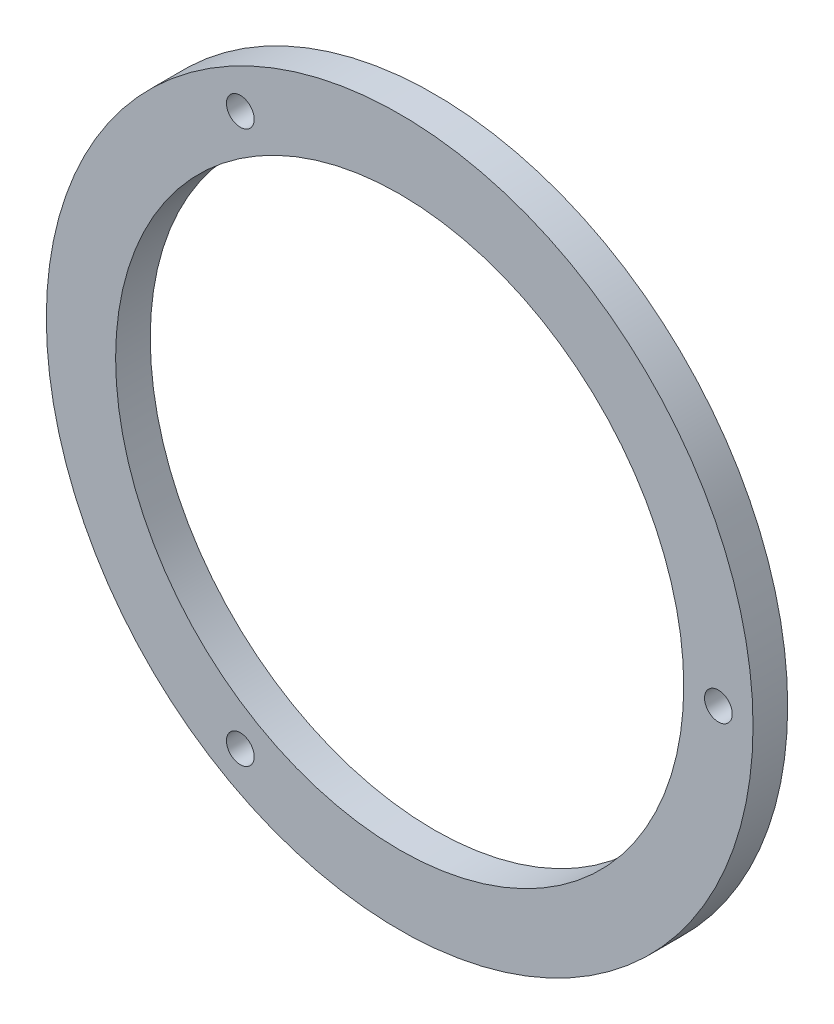
ISO-10303-21;
HEADER;
FILE_DESCRIPTION(('STEP AP214'),'2;1');
FILE_NAME('part.step','',(''),(''),'','','');
FILE_SCHEMA(('AUTOMOTIVE_DESIGN { 1 0 10303 214 1 1 1 1 }'));
ENDSEC;
DATA;
#1=APPLICATION_CONTEXT('core data for automotive mechanical design processes');
#2=APPLICATION_PROTOCOL_DEFINITION('international standard','automotive_design',2000,#1);
#3=PRODUCT_CONTEXT('',#1,'mechanical');
#4=PRODUCT('Part','Part','',(#3));
#5=PRODUCT_RELATED_PRODUCT_CATEGORY('part','',(#4));
#6=PRODUCT_DEFINITION_FORMATION('','',#4);
#7=PRODUCT_DEFINITION_CONTEXT('part definition',#1,'design');
#8=PRODUCT_DEFINITION('design','',#6,#7);
#9=PRODUCT_DEFINITION_SHAPE('','',#8);
#10=(LENGTH_UNIT() NAMED_UNIT(*) SI_UNIT(.MILLI.,.METRE.));
#11=(NAMED_UNIT(*) PLANE_ANGLE_UNIT() SI_UNIT($,.RADIAN.));
#12=(NAMED_UNIT(*) SI_UNIT($,.STERADIAN.) SOLID_ANGLE_UNIT());
#13=UNCERTAINTY_MEASURE_WITH_UNIT(LENGTH_MEASURE(1.E-05),#10,'distance_accuracy_value','');
#14=(GEOMETRIC_REPRESENTATION_CONTEXT(3) GLOBAL_UNCERTAINTY_ASSIGNED_CONTEXT((#13)) GLOBAL_UNIT_ASSIGNED_CONTEXT((#10,
#11,#12)) REPRESENTATION_CONTEXT('',''));
#15=CARTESIAN_POINT('',(0.,0.,0.));
#16=DIRECTION('',(0.,0.,1.));
#17=DIRECTION('',(1.,0.,0.));
#18=AXIS2_PLACEMENT_3D('',#15,#16,#17);
#19=CARTESIAN_POINT('',(0.,0.,5.));
#20=DIRECTION('',(0.,0.,1.));
#21=DIRECTION('',(1.,0.,0.));
#22=AXIS2_PLACEMENT_3D('',#19,#20,#21);
#23=PLANE('',#22);
#24=CARTESIAN_POINT('',(-23.,39.8371685740842,5.));
#25=DIRECTION('',(0.,0.,1.));
#26=DIRECTION('',(1.,0.,0.));
#27=AXIS2_PLACEMENT_3D('',#24,#25,#26);
#28=CIRCLE('',#27,2.);
#29=CARTESIAN_POINT('',(-21.,39.8371685740842,5.));
#30=VERTEX_POINT('',#29);
#31=EDGE_CURVE('E52',#30,#30,#28,.T.);
#32=ORIENTED_EDGE('',*,*,#31,.F.);
#33=EDGE_LOOP('',(#32));
#34=FACE_BOUND('',#33,.T.);
#35=CARTESIAN_POINT('',(46.,0.,5.));
#36=DIRECTION('',(0.,0.,1.));
#37=DIRECTION('',(1.,0.,0.));
#38=AXIS2_PLACEMENT_3D('',#35,#36,#37);
#39=CIRCLE('',#38,2.);
#40=CARTESIAN_POINT('',(48.,0.,5.));
#41=VERTEX_POINT('',#40);
#42=EDGE_CURVE('E41',#41,#41,#39,.T.);
#43=ORIENTED_EDGE('',*,*,#42,.F.);
#44=EDGE_LOOP('',(#43));
#45=FACE_BOUND('',#44,.T.);
#46=CARTESIAN_POINT('',(0.,0.,5.));
#47=DIRECTION('',(0.,0.,1.));
#48=DIRECTION('',(1.,0.,0.));
#49=AXIS2_PLACEMENT_3D('',#46,#47,#48);
#50=CIRCLE('',#49,51.);
#51=CARTESIAN_POINT('',(51.,0.,5.));
#52=VERTEX_POINT('',#51);
#53=EDGE_CURVE('E10',#52,#52,#50,.T.);
#54=ORIENTED_EDGE('',*,*,#53,.T.);
#55=EDGE_LOOP('',(#54));
#56=FACE_BOUND('',#55,.T.);
#57=CARTESIAN_POINT('',(-23.,-39.8371685740842,5.));
#58=DIRECTION('',(0.,0.,1.));
#59=DIRECTION('',(1.,0.,0.));
#60=AXIS2_PLACEMENT_3D('',#57,#58,#59);
#61=CIRCLE('',#60,2.);
#62=CARTESIAN_POINT('',(-21.,-39.8371685740842,5.));
#63=VERTEX_POINT('',#62);
#64=EDGE_CURVE('E46',#63,#63,#61,.T.);
#65=ORIENTED_EDGE('',*,*,#64,.F.);
#66=EDGE_LOOP('',(#65));
#67=FACE_BOUND('',#66,.T.);
#68=CARTESIAN_POINT('',(0.,0.,5.));
#69=DIRECTION('',(0.,0.,1.));
#70=DIRECTION('',(1.,0.,0.));
#71=AXIS2_PLACEMENT_3D('',#68,#69,#70);
#72=CIRCLE('',#71,41.);
#73=CARTESIAN_POINT('',(41.,0.,5.));
#74=VERTEX_POINT('',#73);
#75=EDGE_CURVE('E58',#74,#74,#72,.T.);
#76=ORIENTED_EDGE('',*,*,#75,.F.);
#77=EDGE_LOOP('',(#76));
#78=FACE_BOUND('',#77,.T.);
#79=ADVANCED_FACE('F30',(#34,#45,#56,#67,#78),#23,.T.);
#80=CARTESIAN_POINT('',(0.,0.,0.));
#81=DIRECTION('',(0.,0.,1.));
#82=DIRECTION('',(1.,0.,0.));
#83=AXIS2_PLACEMENT_3D('',#80,#81,#82);
#84=PLANE('',#83);
#85=CARTESIAN_POINT('',(0.,0.,0.));
#86=DIRECTION('',(0.,0.,1.));
#87=DIRECTION('',(1.,0.,0.));
#88=AXIS2_PLACEMENT_3D('',#85,#86,#87);
#89=CIRCLE('',#88,51.);
#90=CARTESIAN_POINT('',(51.,0.,0.));
#91=VERTEX_POINT('',#90);
#92=EDGE_CURVE('E34',#91,#91,#89,.T.);
#93=ORIENTED_EDGE('',*,*,#92,.F.);
#94=EDGE_LOOP('',(#93));
#95=FACE_BOUND('',#94,.T.);
#96=CARTESIAN_POINT('',(46.,0.,0.));
#97=DIRECTION('',(0.,0.,1.));
#98=DIRECTION('',(1.,0.,0.));
#99=AXIS2_PLACEMENT_3D('',#96,#97,#98);
#100=CIRCLE('',#99,2.);
#101=CARTESIAN_POINT('',(48.,0.,0.));
#102=VERTEX_POINT('',#101);
#103=EDGE_CURVE('E43',#102,#102,#100,.T.);
#104=ORIENTED_EDGE('',*,*,#103,.T.);
#105=EDGE_LOOP('',(#104));
#106=FACE_BOUND('',#105,.T.);
#107=CARTESIAN_POINT('',(-23.,-39.8371685740842,0.));
#108=DIRECTION('',(0.,0.,1.));
#109=DIRECTION('',(1.,0.,0.));
#110=AXIS2_PLACEMENT_3D('',#107,#108,#109);
#111=CIRCLE('',#110,2.);
#112=CARTESIAN_POINT('',(-21.,-39.8371685740842,0.));
#113=VERTEX_POINT('',#112);
#114=EDGE_CURVE('E49',#113,#113,#111,.T.);
#115=ORIENTED_EDGE('',*,*,#114,.T.);
#116=EDGE_LOOP('',(#115));
#117=FACE_BOUND('',#116,.T.);
#118=CARTESIAN_POINT('',(-23.,39.8371685740842,0.));
#119=DIRECTION('',(0.,0.,1.));
#120=DIRECTION('',(1.,0.,0.));
#121=AXIS2_PLACEMENT_3D('',#118,#119,#120);
#122=CIRCLE('',#121,2.);
#123=CARTESIAN_POINT('',(-21.,39.8371685740842,0.));
#124=VERTEX_POINT('',#123);
#125=EDGE_CURVE('E55',#124,#124,#122,.T.);
#126=ORIENTED_EDGE('',*,*,#125,.T.);
#127=EDGE_LOOP('',(#126));
#128=FACE_BOUND('',#127,.T.);
#129=CARTESIAN_POINT('',(0.,0.,0.));
#130=DIRECTION('',(0.,0.,1.));
#131=DIRECTION('',(1.,0.,0.));
#132=AXIS2_PLACEMENT_3D('',#129,#130,#131);
#133=CIRCLE('',#132,41.);
#134=CARTESIAN_POINT('',(41.,0.,0.));
#135=VERTEX_POINT('',#134);
#136=EDGE_CURVE('E61',#135,#135,#133,.T.);
#137=ORIENTED_EDGE('',*,*,#136,.T.);
#138=EDGE_LOOP('',(#137));
#139=FACE_BOUND('',#138,.T.);
#140=ADVANCED_FACE('F71',(#95,#106,#117,#128,#139),#84,.F.);
#141=CARTESIAN_POINT('',(0.,0.,5.));
#142=DIRECTION('',(0.,0.,-1.));
#143=DIRECTION('',(-1.,0.,0.));
#144=AXIS2_PLACEMENT_3D('',#141,#142,#143);
#145=CYLINDRICAL_SURFACE('',#144,51.);
#146=ORIENTED_EDGE('',*,*,#53,.F.);
#147=EDGE_LOOP('',(#146));
#148=FACE_BOUND('',#147,.T.);
#149=ORIENTED_EDGE('',*,*,#92,.T.);
#150=EDGE_LOOP('',(#149));
#151=FACE_BOUND('',#150,.T.);
#152=ADVANCED_FACE('F32',(#148,#151),#145,.T.);
#153=CARTESIAN_POINT('',(46.,0.,5.));
#154=DIRECTION('',(0.,0.,-1.));
#155=DIRECTION('',(-1.,0.,0.));
#156=AXIS2_PLACEMENT_3D('',#153,#154,#155);
#157=CYLINDRICAL_SURFACE('',#156,2.);
#158=ORIENTED_EDGE('',*,*,#42,.T.);
#159=EDGE_LOOP('',(#158));
#160=FACE_BOUND('',#159,.T.);
#161=ORIENTED_EDGE('',*,*,#103,.F.);
#162=EDGE_LOOP('',(#161));
#163=FACE_BOUND('',#162,.T.);
#164=ADVANCED_FACE('F81',(#160,#163),#157,.F.);
#165=CARTESIAN_POINT('',(-23.,-39.8371685740842,5.));
#166=DIRECTION('',(0.,0.,-1.));
#167=DIRECTION('',(-1.,0.,0.));
#168=AXIS2_PLACEMENT_3D('',#165,#166,#167);
#169=CYLINDRICAL_SURFACE('',#168,2.);
#170=ORIENTED_EDGE('',*,*,#64,.T.);
#171=EDGE_LOOP('',(#170));
#172=FACE_BOUND('',#171,.T.);
#173=ORIENTED_EDGE('',*,*,#114,.F.);
#174=EDGE_LOOP('',(#173));
#175=FACE_BOUND('',#174,.T.);
#176=ADVANCED_FACE('F84',(#172,#175),#169,.F.);
#177=CARTESIAN_POINT('',(-23.,39.8371685740842,5.));
#178=DIRECTION('',(0.,0.,-1.));
#179=DIRECTION('',(-1.,0.,0.));
#180=AXIS2_PLACEMENT_3D('',#177,#178,#179);
#181=CYLINDRICAL_SURFACE('',#180,2.);
#182=ORIENTED_EDGE('',*,*,#31,.T.);
#183=EDGE_LOOP('',(#182));
#184=FACE_BOUND('',#183,.T.);
#185=ORIENTED_EDGE('',*,*,#125,.F.);
#186=EDGE_LOOP('',(#185));
#187=FACE_BOUND('',#186,.T.);
#188=ADVANCED_FACE('F88',(#184,#187),#181,.F.);
#189=CARTESIAN_POINT('',(0.,0.,5.));
#190=DIRECTION('',(0.,0.,-1.));
#191=DIRECTION('',(-1.,0.,0.));
#192=AXIS2_PLACEMENT_3D('',#189,#190,#191);
#193=CYLINDRICAL_SURFACE('',#192,41.);
#194=ORIENTED_EDGE('',*,*,#75,.T.);
#195=EDGE_LOOP('',(#194));
#196=FACE_BOUND('',#195,.T.);
#197=ORIENTED_EDGE('',*,*,#136,.F.);
#198=EDGE_LOOP('',(#197));
#199=FACE_BOUND('',#198,.T.);
#200=ADVANCED_FACE('F67',(#196,#199),#193,.F.);
#201=CLOSED_SHELL('',(#79,#140,#152,#164,#176,#188,#200));
#202=MANIFOLD_SOLID_BREP('B2',#201);
#203=ADVANCED_BREP_SHAPE_REPRESENTATION('',(#18,#202),#14);
#204=SHAPE_DEFINITION_REPRESENTATION(#9,#203);
ENDSEC;
END-ISO-10303-21;
